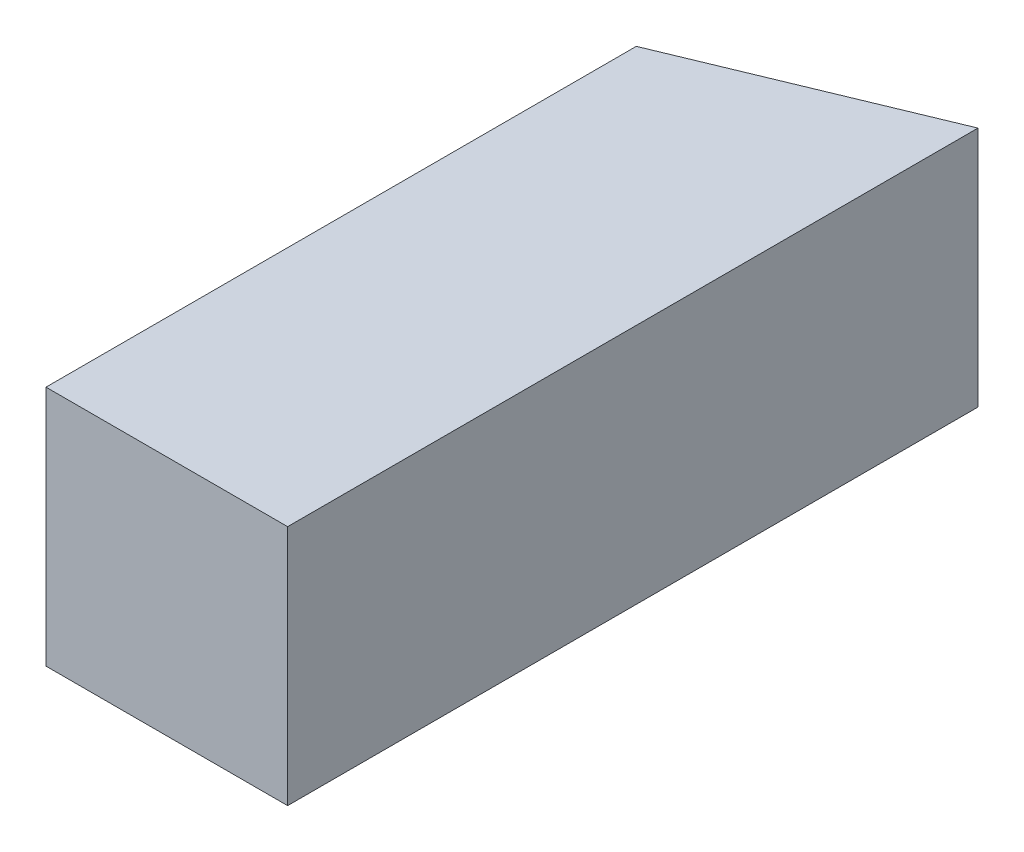
ISO-10303-21;
HEADER;
FILE_DESCRIPTION(('STEP AP214'),'2;1');
FILE_NAME('part.step','',(''),(''),'','','');
FILE_SCHEMA(('AUTOMOTIVE_DESIGN { 1 0 10303 214 1 1 1 1 }'));
ENDSEC;
DATA;
#1=APPLICATION_CONTEXT('core data for automotive mechanical design processes');
#2=APPLICATION_PROTOCOL_DEFINITION('international standard','automotive_design',2000,#1);
#3=PRODUCT_CONTEXT('',#1,'mechanical');
#4=PRODUCT('Part','Part','',(#3));
#5=PRODUCT_RELATED_PRODUCT_CATEGORY('part','',(#4));
#6=PRODUCT_DEFINITION_FORMATION('','',#4);
#7=PRODUCT_DEFINITION_CONTEXT('part definition',#1,'design');
#8=PRODUCT_DEFINITION('design','',#6,#7);
#9=PRODUCT_DEFINITION_SHAPE('','',#8);
#10=(LENGTH_UNIT() NAMED_UNIT(*) SI_UNIT(.MILLI.,.METRE.));
#11=(NAMED_UNIT(*) PLANE_ANGLE_UNIT() SI_UNIT($,.RADIAN.));
#12=(NAMED_UNIT(*) SI_UNIT($,.STERADIAN.) SOLID_ANGLE_UNIT());
#13=UNCERTAINTY_MEASURE_WITH_UNIT(LENGTH_MEASURE(1.E-05),#10,'distance_accuracy_value','');
#14=(GEOMETRIC_REPRESENTATION_CONTEXT(3) GLOBAL_UNCERTAINTY_ASSIGNED_CONTEXT((#13)) GLOBAL_UNIT_ASSIGNED_CONTEXT((#10,
#11,#12)) REPRESENTATION_CONTEXT('',''));
#15=CARTESIAN_POINT('',(0.,0.,0.));
#16=DIRECTION('',(0.,0.,1.));
#17=DIRECTION('',(1.,0.,0.));
#18=AXIS2_PLACEMENT_3D('',#15,#16,#17);
#19=CARTESIAN_POINT('',(44.45,-44.45,254.));
#20=DIRECTION('',(-1.,0.,0.));
#21=DIRECTION('',(0.,0.,1.));
#22=AXIS2_PLACEMENT_3D('',#19,#20,#21);
#23=PLANE('',#22);
#24=DIRECTION('',(0.,1.,0.));
#25=VECTOR('',#24,1.);
#26=CARTESIAN_POINT('',(44.45,-44.45,0.));
#27=LINE('',#26,#25);
#28=CARTESIAN_POINT('',(44.45,-44.45,0.));
#29=VERTEX_POINT('',#28);
#30=CARTESIAN_POINT('',(44.45,44.45,0.));
#31=VERTEX_POINT('',#30);
#32=EDGE_CURVE('E81',#29,#31,#27,.T.);
#33=ORIENTED_EDGE('',*,*,#32,.T.);
#34=DIRECTION('',(0.,0.,-1.));
#35=VECTOR('',#34,1.);
#36=CARTESIAN_POINT('',(44.45,44.45,254.));
#37=LINE('',#36,#35);
#38=CARTESIAN_POINT('',(44.45,44.45,254.));
#39=VERTEX_POINT('',#38);
#40=EDGE_CURVE('E11',#39,#31,#37,.T.);
#41=ORIENTED_EDGE('',*,*,#40,.F.);
#42=DIRECTION('',(0.,1.,0.));
#43=VECTOR('',#42,1.);
#44=CARTESIAN_POINT('',(44.45,-44.45,254.));
#45=LINE('',#44,#43);
#46=CARTESIAN_POINT('',(44.45,-44.45,254.));
#47=VERTEX_POINT('',#46);
#48=EDGE_CURVE('E92',#47,#39,#45,.T.);
#49=ORIENTED_EDGE('',*,*,#48,.F.);
#50=DIRECTION('',(0.,0.,-1.));
#51=VECTOR('',#50,1.);
#52=CARTESIAN_POINT('',(44.45,-44.45,254.));
#53=LINE('',#52,#51);
#54=EDGE_CURVE('E98',#47,#29,#53,.T.);
#55=ORIENTED_EDGE('',*,*,#54,.T.);
#56=EDGE_LOOP('',(#33,#41,#49,#55));
#57=FACE_BOUND('',#56,.T.);
#58=ADVANCED_FACE('F44',(#57),#23,.F.);
#59=CARTESIAN_POINT('',(-44.45,44.45,254.));
#60=DIRECTION('',(0.,-1.,0.));
#61=DIRECTION('',(0.,0.,-1.));
#62=AXIS2_PLACEMENT_3D('',#59,#60,#61);
#63=PLANE('',#62);
#64=ORIENTED_EDGE('',*,*,#40,.T.);
#65=DIRECTION('',(0.923879532511289,0.,-0.382683432365084));
#66=VECTOR('',#65,1.);
#67=CARTESIAN_POINT('',(44.45,44.45,0.));
#68=LINE('',#67,#66);
#69=CARTESIAN_POINT('',(-44.45,44.45,36.8235856949675));
#70=VERTEX_POINT('',#69);
#71=EDGE_CURVE('E87',#70,#31,#68,.T.);
#72=ORIENTED_EDGE('',*,*,#71,.F.);
#73=DIRECTION('',(0.,0.,-1.));
#74=VECTOR('',#73,1.);
#75=CARTESIAN_POINT('',(-44.45,44.45,254.));
#76=LINE('',#75,#74);
#77=CARTESIAN_POINT('',(-44.45,44.45,254.));
#78=VERTEX_POINT('',#77);
#79=EDGE_CURVE('E53',#78,#70,#76,.T.);
#80=ORIENTED_EDGE('',*,*,#79,.F.);
#81=DIRECTION('',(-1.,0.,0.));
#82=VECTOR('',#81,1.);
#83=CARTESIAN_POINT('',(-44.45,44.45,254.));
#84=LINE('',#83,#82);
#85=EDGE_CURVE('E119',#39,#78,#84,.T.);
#86=ORIENTED_EDGE('',*,*,#85,.F.);
#87=EDGE_LOOP('',(#64,#72,#80,#86));
#88=FACE_BOUND('',#87,.T.);
#89=ADVANCED_FACE('F118',(#88),#63,.F.);
#90=CARTESIAN_POINT('',(-44.45,-44.45,254.));
#91=DIRECTION('',(1.,0.,0.));
#92=DIRECTION('',(0.,0.,-1.));
#93=AXIS2_PLACEMENT_3D('',#90,#91,#92);
#94=PLANE('',#93);
#95=ORIENTED_EDGE('',*,*,#79,.T.);
#96=DIRECTION('',(0.,-1.,0.));
#97=VECTOR('',#96,1.);
#98=CARTESIAN_POINT('',(-44.45,44.451,36.8235856949675));
#99=LINE('',#98,#97);
#100=CARTESIAN_POINT('',(-44.45,-44.45,36.8235856949675));
#101=VERTEX_POINT('',#100);
#102=EDGE_CURVE('E93',#70,#101,#99,.T.);
#103=ORIENTED_EDGE('',*,*,#102,.T.);
#104=DIRECTION('',(0.,0.,-1.));
#105=VECTOR('',#104,1.);
#106=CARTESIAN_POINT('',(-44.45,-44.45,254.));
#107=LINE('',#106,#105);
#108=CARTESIAN_POINT('',(-44.45,-44.45,254.));
#109=VERTEX_POINT('',#108);
#110=EDGE_CURVE('E101',#109,#101,#107,.T.);
#111=ORIENTED_EDGE('',*,*,#110,.F.);
#112=DIRECTION('',(0.,-1.,0.));
#113=VECTOR('',#112,1.);
#114=CARTESIAN_POINT('',(-44.45,-44.45,254.));
#115=LINE('',#114,#113);
#116=EDGE_CURVE('E109',#78,#109,#115,.T.);
#117=ORIENTED_EDGE('',*,*,#116,.F.);
#118=EDGE_LOOP('',(#95,#103,#111,#117));
#119=FACE_BOUND('',#118,.T.);
#120=ADVANCED_FACE('F116',(#119),#94,.F.);
#121=CARTESIAN_POINT('',(-44.45,-44.45,254.));
#122=DIRECTION('',(0.,1.,0.));
#123=DIRECTION('',(0.,0.,1.));
#124=AXIS2_PLACEMENT_3D('',#121,#122,#123);
#125=PLANE('',#124);
#126=ORIENTED_EDGE('',*,*,#110,.T.);
#127=DIRECTION('',(-0.923879532511289,0.,0.382683432365084));
#128=VECTOR('',#127,1.);
#129=CARTESIAN_POINT('',(44.45,-44.45,0.));
#130=LINE('',#129,#128);
#131=EDGE_CURVE('E84',#29,#101,#130,.T.);
#132=ORIENTED_EDGE('',*,*,#131,.F.);
#133=ORIENTED_EDGE('',*,*,#54,.F.);
#134=DIRECTION('',(1.,0.,0.));
#135=VECTOR('',#134,1.);
#136=CARTESIAN_POINT('',(-44.45,-44.45,254.));
#137=LINE('',#136,#135);
#138=EDGE_CURVE('E60',#109,#47,#137,.T.);
#139=ORIENTED_EDGE('',*,*,#138,.F.);
#140=EDGE_LOOP('',(#126,#132,#133,#139));
#141=FACE_BOUND('',#140,.T.);
#142=ADVANCED_FACE('F97',(#141),#125,.F.);
#143=CARTESIAN_POINT('',(0.,0.,254.));
#144=DIRECTION('',(0.,0.,-1.));
#145=DIRECTION('',(-1.,0.,0.));
#146=AXIS2_PLACEMENT_3D('',#143,#144,#145);
#147=PLANE('',#146);
#148=ORIENTED_EDGE('',*,*,#48,.T.);
#149=ORIENTED_EDGE('',*,*,#85,.T.);
#150=ORIENTED_EDGE('',*,*,#116,.T.);
#151=ORIENTED_EDGE('',*,*,#138,.T.);
#152=EDGE_LOOP('',(#148,#149,#150,#151));
#153=FACE_BOUND('',#152,.T.);
#154=ADVANCED_FACE('F130',(#153),#147,.F.);
#155=CARTESIAN_POINT('',(44.45,44.451,0.));
#156=DIRECTION('',(0.382683432365084,0.,0.923879532511289));
#157=DIRECTION('',(0.923879532511289,0.,-0.382683432365084));
#158=AXIS2_PLACEMENT_3D('',#155,#156,#157);
#159=PLANE('',#158);
#160=ORIENTED_EDGE('',*,*,#71,.T.);
#161=ORIENTED_EDGE('',*,*,#32,.F.);
#162=ORIENTED_EDGE('',*,*,#131,.T.);
#163=ORIENTED_EDGE('',*,*,#102,.F.);
#164=EDGE_LOOP('',(#160,#161,#162,#163));
#165=FACE_BOUND('',#164,.T.);
#166=ADVANCED_FACE('F83',(#165),#159,.F.);
#167=CLOSED_SHELL('',(#58,#89,#120,#142,#154,#166));
#168=MANIFOLD_SOLID_BREP('B2',#167);
#169=ADVANCED_BREP_SHAPE_REPRESENTATION('',(#18,#168),#14);
#170=SHAPE_DEFINITION_REPRESENTATION(#9,#169);
ENDSEC;
END-ISO-10303-21;
